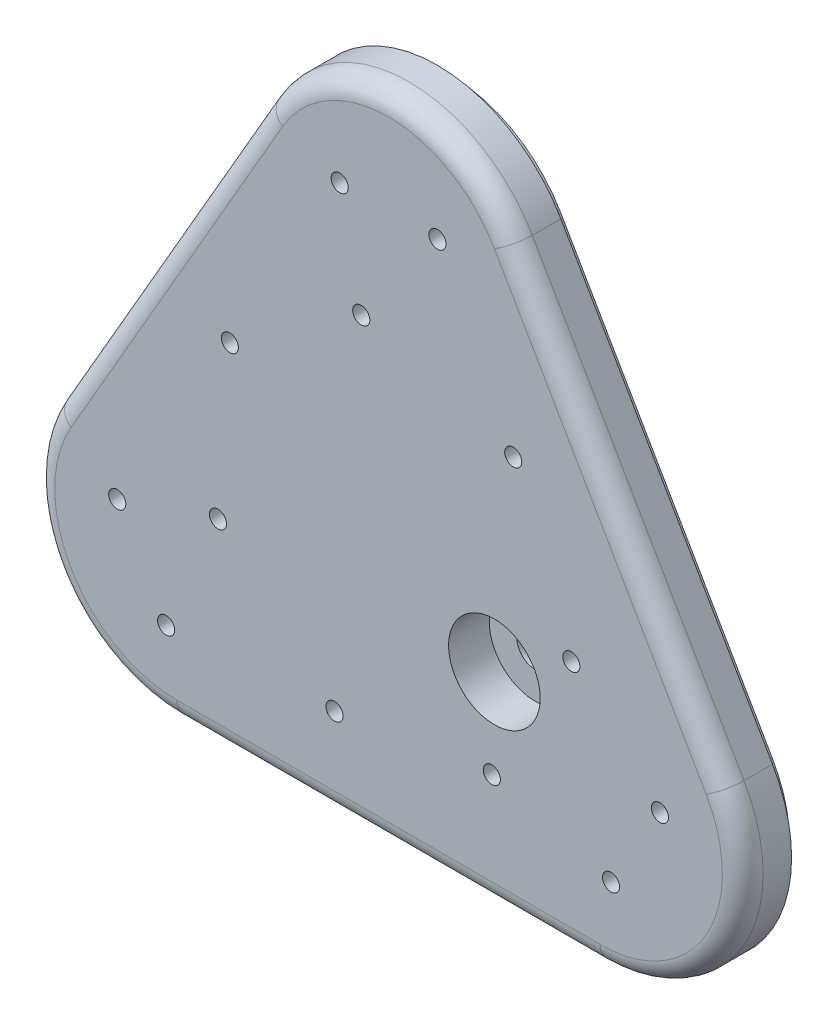
ISO-10303-21;
HEADER;
FILE_DESCRIPTION(('STEP AP214'),'2;1');
FILE_NAME('part.step','',(''),(''),'','','');
FILE_SCHEMA(('AUTOMOTIVE_DESIGN { 1 0 10303 214 1 1 1 1 }'));
ENDSEC;
DATA;
#1=APPLICATION_CONTEXT('core data for automotive mechanical design processes');
#2=APPLICATION_PROTOCOL_DEFINITION('international standard','automotive_design',2000,#1);
#3=PRODUCT_CONTEXT('',#1,'mechanical');
#4=PRODUCT('Part','Part','',(#3));
#5=PRODUCT_RELATED_PRODUCT_CATEGORY('part','',(#4));
#6=PRODUCT_DEFINITION_FORMATION('','',#4);
#7=PRODUCT_DEFINITION_CONTEXT('part definition',#1,'design');
#8=PRODUCT_DEFINITION('design','',#6,#7);
#9=PRODUCT_DEFINITION_SHAPE('','',#8);
#10=(LENGTH_UNIT() NAMED_UNIT(*) SI_UNIT(.MILLI.,.METRE.));
#11=(NAMED_UNIT(*) PLANE_ANGLE_UNIT() SI_UNIT($,.RADIAN.));
#12=(NAMED_UNIT(*) SI_UNIT($,.STERADIAN.) SOLID_ANGLE_UNIT());
#13=UNCERTAINTY_MEASURE_WITH_UNIT(LENGTH_MEASURE(1.E-05),#10,'distance_accuracy_value','');
#14=(GEOMETRIC_REPRESENTATION_CONTEXT(3) GLOBAL_UNCERTAINTY_ASSIGNED_CONTEXT((#13)) GLOBAL_UNIT_ASSIGNED_CONTEXT((#10,
#11,#12)) REPRESENTATION_CONTEXT('',''));
#15=CARTESIAN_POINT('',(0.,0.,0.));
#16=DIRECTION('',(0.,0.,1.));
#17=DIRECTION('',(1.,0.,0.));
#18=AXIS2_PLACEMENT_3D('',#15,#16,#17);
#19=CARTESIAN_POINT('',(25.9807621135331,-15.0000000000001,15.));
#20=DIRECTION('',(0.,0.,-1.));
#21=DIRECTION('',(-1.,0.,0.));
#22=AXIS2_PLACEMENT_3D('',#19,#20,#21);
#23=CYLINDRICAL_SURFACE('',#22,4.5);
#24=CARTESIAN_POINT('',(25.9807621135331,-15.0000000000001,0.));
#25=DIRECTION('',(0.,0.,1.));
#26=DIRECTION('',(1.,0.,0.));
#27=AXIS2_PLACEMENT_3D('',#24,#25,#26);
#28=CIRCLE('',#27,4.5);
#29=CARTESIAN_POINT('',(30.4807621135331,-15.0000000000001,0.));
#30=VERTEX_POINT('',#29);
#31=EDGE_CURVE('E322',#30,#30,#28,.T.);
#32=ORIENTED_EDGE('',*,*,#31,.F.);
#33=EDGE_LOOP('',(#32));
#34=FACE_BOUND('',#33,.T.);
#35=CARTESIAN_POINT('',(25.9807621135331,-15.0000000000001,5.));
#36=DIRECTION('',(0.,0.,1.));
#37=DIRECTION('',(1.,0.,0.));
#38=AXIS2_PLACEMENT_3D('',#35,#36,#37);
#39=CIRCLE('',#38,4.5);
#40=CARTESIAN_POINT('',(30.4807621135331,-15.0000000000001,5.));
#41=VERTEX_POINT('',#40);
#42=EDGE_CURVE('E210',#41,#41,#39,.T.);
#43=ORIENTED_EDGE('',*,*,#42,.T.);
#44=EDGE_LOOP('',(#43));
#45=FACE_BOUND('',#44,.T.);
#46=ADVANCED_FACE('F45',(#34,#45),#23,.F.);
#47=CARTESIAN_POINT('',(0.,60.,0.));
#48=DIRECTION('',(0.,0.,1.));
#49=DIRECTION('',(1.,0.,0.));
#50=AXIS2_PLACEMENT_3D('',#47,#48,#49);
#51=PLANE('',#50);
#52=CARTESIAN_POINT('',(54.6217782649105,-45.3923048454135,0.));
#53=DIRECTION('',(0.,0.,1.));
#54=DIRECTION('',(1.,0.,0.));
#55=AXIS2_PLACEMENT_3D('',#52,#53,#54);
#56=CIRCLE('',#55,2.1);
#57=CARTESIAN_POINT('',(56.7217782649105,-45.3923048454135,0.));
#58=VERTEX_POINT('',#57);
#59=EDGE_CURVE('E317',#58,#58,#56,.T.);
#60=ORIENTED_EDGE('',*,*,#59,.T.);
#61=EDGE_LOOP('',(#60));
#62=FACE_BOUND('',#61,.T.);
#63=ORIENTED_EDGE('',*,*,#31,.T.);
#64=EDGE_LOOP('',(#63));
#65=FACE_BOUND('',#64,.T.);
#66=CARTESIAN_POINT('',(66.6217782649106,-24.6076951545871,0.));
#67=DIRECTION('',(0.,0.,1.));
#68=DIRECTION('',(1.,0.,0.));
#69=AXIS2_PLACEMENT_3D('',#66,#67,#68);
#70=CIRCLE('',#69,2.1);
#71=CARTESIAN_POINT('',(68.7217782649106,-24.6076951545871,0.));
#72=VERTEX_POINT('',#71);
#73=EDGE_CURVE('E329',#72,#72,#70,.T.);
#74=ORIENTED_EDGE('',*,*,#73,.T.);
#75=EDGE_LOOP('',(#74));
#76=FACE_BOUND('',#75,.T.);
#77=CARTESIAN_POINT('',(-54.6217782649111,-45.3923048454127,0.));
#78=DIRECTION('',(0.,0.,1.));
#79=DIRECTION('',(-1.,0.,0.));
#80=AXIS2_PLACEMENT_3D('',#77,#78,#79);
#81=CIRCLE('',#80,2.1);
#82=CARTESIAN_POINT('',(-56.7217782649111,-45.3923048454127,0.));
#83=VERTEX_POINT('',#82);
#84=EDGE_CURVE('E334',#83,#83,#81,.T.);
#85=ORIENTED_EDGE('',*,*,#84,.T.);
#86=EDGE_LOOP('',(#85));
#87=FACE_BOUND('',#86,.T.);
#88=CARTESIAN_POINT('',(12.,70.,0.));
#89=DIRECTION('',(0.,0.,1.));
#90=DIRECTION('',(-1.,0.,0.));
#91=AXIS2_PLACEMENT_3D('',#88,#89,#90);
#92=CIRCLE('',#91,2.1);
#93=CARTESIAN_POINT('',(9.9,70.,0.));
#94=VERTEX_POINT('',#93);
#95=EDGE_CURVE('E342',#94,#94,#92,.T.);
#96=ORIENTED_EDGE('',*,*,#95,.T.);
#97=EDGE_LOOP('',(#96));
#98=FACE_BOUND('',#97,.T.);
#99=CARTESIAN_POINT('',(-66.6217782649109,-24.6076951545861,0.));
#100=DIRECTION('',(0.,0.,1.));
#101=DIRECTION('',(1.,0.,0.));
#102=AXIS2_PLACEMENT_3D('',#99,#100,#101);
#103=CIRCLE('',#102,2.10000000000001);
#104=CARTESIAN_POINT('',(-64.5217782649109,-24.6076951545861,0.));
#105=VERTEX_POINT('',#104);
#106=EDGE_CURVE('E350',#105,#105,#103,.T.);
#107=ORIENTED_EDGE('',*,*,#106,.T.);
#108=EDGE_LOOP('',(#107));
#109=FACE_BOUND('',#108,.T.);
#110=CARTESIAN_POINT('',(-12.,70.,0.));
#111=DIRECTION('',(0.,0.,1.));
#112=DIRECTION('',(1.,0.,0.));
#113=AXIS2_PLACEMENT_3D('',#110,#111,#112);
#114=CIRCLE('',#113,2.1);
#115=CARTESIAN_POINT('',(-9.9,70.,0.));
#116=VERTEX_POINT('',#115);
#117=EDGE_CURVE('E358',#116,#116,#114,.T.);
#118=ORIENTED_EDGE('',*,*,#117,.T.);
#119=EDGE_LOOP('',(#118));
#120=FACE_BOUND('',#119,.T.);
#121=CARTESIAN_POINT('',(-38.9711431702997,22.5,0.));
#122=DIRECTION('',(0.,0.,-1.));
#123=DIRECTION('',(-1.,0.,0.));
#124=AXIS2_PLACEMENT_3D('',#121,#122,#123);
#125=CIRCLE('',#124,2.1);
#126=CARTESIAN_POINT('',(-41.0711431702997,22.5,0.));
#127=VERTEX_POINT('',#126);
#128=EDGE_CURVE('E271',#127,#127,#125,.T.);
#129=ORIENTED_EDGE('',*,*,#128,.F.);
#130=EDGE_LOOP('',(#129));
#131=FACE_BOUND('',#130,.T.);
#132=CARTESIAN_POINT('',(-41.8893186889953,-16.4403460964873,0.));
#133=DIRECTION('',(0.,0.,-1.));
#134=DIRECTION('',(-1.,0.,0.));
#135=AXIS2_PLACEMENT_3D('',#132,#133,#134);
#136=CIRCLE('',#135,2.1);
#137=CARTESIAN_POINT('',(-43.9893186889953,-16.4403460964873,0.));
#138=VERTEX_POINT('',#137);
#139=EDGE_CURVE('E262',#138,#138,#136,.T.);
#140=ORIENTED_EDGE('',*,*,#139,.F.);
#141=EDGE_LOOP('',(#140));
#142=FACE_BOUND('',#141,.T.);
#143=CARTESIAN_POINT('',(-13.263982848501,-43.0007762603804,0.));
#144=DIRECTION('',(0.,0.,-1.));
#145=DIRECTION('',(-1.,0.,0.));
#146=AXIS2_PLACEMENT_3D('',#143,#144,#145);
#147=CIRCLE('',#146,2.1);
#148=CARTESIAN_POINT('',(-15.363982848501,-43.0007762603804,0.));
#149=VERTEX_POINT('',#148);
#150=EDGE_CURVE('E272',#149,#149,#147,.T.);
#151=ORIENTED_EDGE('',*,*,#150,.F.);
#152=EDGE_LOOP('',(#151));
#153=FACE_BOUND('',#152,.T.);
#154=CARTESIAN_POINT('',(25.3494026128536,-37.18074484423,0.));
#155=DIRECTION('',(0.,0.,-1.));
#156=DIRECTION('',(-1.,0.,0.));
#157=AXIS2_PLACEMENT_3D('',#154,#155,#156);
#158=CIRCLE('',#157,2.1);
#159=CARTESIAN_POINT('',(23.2494026128536,-37.18074484423,0.));
#160=VERTEX_POINT('',#159);
#161=EDGE_CURVE('E280',#160,#160,#158,.T.);
#162=ORIENTED_EDGE('',*,*,#161,.F.);
#163=EDGE_LOOP('',(#162));
#164=FACE_BOUND('',#163,.T.);
#165=CARTESIAN_POINT('',(44.8741708731491,-3.36285421140237,0.));
#166=DIRECTION('',(0.,0.,-1.));
#167=DIRECTION('',(-1.,0.,0.));
#168=AXIS2_PLACEMENT_3D('',#165,#166,#167);
#169=CIRCLE('',#168,2.1);
#170=CARTESIAN_POINT('',(42.7741708731491,-3.36285421140237,0.));
#171=VERTEX_POINT('',#170);
#172=EDGE_CURVE('E288',#171,#171,#169,.T.);
#173=ORIENTED_EDGE('',*,*,#172,.F.);
#174=EDGE_LOOP('',(#173));
#175=FACE_BOUND('',#174,.T.);
#176=CARTESIAN_POINT('',(30.6077731996931,32.9873342323312,0.));
#177=DIRECTION('',(0.,0.,-1.));
#178=DIRECTION('',(-1.,0.,0.));
#179=AXIS2_PLACEMENT_3D('',#176,#177,#178);
#180=CIRCLE('',#179,2.1);
#181=CARTESIAN_POINT('',(28.5077731996931,32.9873342323312,0.));
#182=VERTEX_POINT('',#181);
#183=EDGE_CURVE('E296',#182,#182,#180,.T.);
#184=ORIENTED_EDGE('',*,*,#183,.F.);
#185=EDGE_LOOP('',(#184));
#186=FACE_BOUND('',#185,.T.);
#187=CARTESIAN_POINT('',(-6.70690197792434,44.4973871801257,0.));
#188=DIRECTION('',(0.,0.,-1.));
#189=DIRECTION('',(-1.,0.,0.));
#190=AXIS2_PLACEMENT_3D('',#187,#188,#189);
#191=CIRCLE('',#190,2.1);
#192=CARTESIAN_POINT('',(-8.80690197792434,44.4973871801257,0.));
#193=VERTEX_POINT('',#192);
#194=EDGE_CURVE('E261',#193,#193,#191,.T.);
#195=ORIENTED_EDGE('',*,*,#194,.F.);
#196=EDGE_LOOP('',(#195));
#197=FACE_BOUND('',#196,.T.);
#198=CARTESIAN_POINT('',(-51.9615242270666,-29.9999999999995,0.));
#199=DIRECTION('',(0.,0.,-1.));
#200=DIRECTION('',(-1.,0.,0.));
#201=AXIS2_PLACEMENT_3D('',#198,#199,#200);
#202=CIRCLE('',#201,31.5);
#203=CARTESIAN_POINT('',(-51.9615242270669,-61.4999999999995,0.));
#204=VERTEX_POINT('',#203);
#205=CARTESIAN_POINT('',(-79.2413244462764,-14.2499999999994,0.));
#206=VERTEX_POINT('',#205);
#207=EDGE_CURVE('E207',#204,#206,#202,.T.);
#208=ORIENTED_EDGE('',*,*,#207,.T.);
#209=DIRECTION('',(0.500000000000004,0.866025403784436,0.));
#210=VECTOR('',#209,1.);
#211=CARTESIAN_POINT('',(-27.2798002192097,75.7500000000001,0.));
#212=LINE('',#211,#210);
#213=CARTESIAN_POINT('',(-27.2798002192097,75.7500000000001,0.));
#214=VERTEX_POINT('',#213);
#215=EDGE_CURVE('E160',#206,#214,#212,.T.);
#216=ORIENTED_EDGE('',*,*,#215,.T.);
#217=CARTESIAN_POINT('',(0.,60.,0.));
#218=DIRECTION('',(0.,0.,-1.));
#219=DIRECTION('',(-1.,0.,0.));
#220=AXIS2_PLACEMENT_3D('',#217,#218,#219);
#221=CIRCLE('',#220,31.5);
#222=CARTESIAN_POINT('',(27.2798002192099,75.7499999999999,0.));
#223=VERTEX_POINT('',#222);
#224=EDGE_CURVE('E213',#214,#223,#221,.T.);
#225=ORIENTED_EDGE('',*,*,#224,.T.);
#226=DIRECTION('',(0.499999999999998,-0.86602540378444,0.));
#227=VECTOR('',#226,1.);
#228=CARTESIAN_POINT('',(79.241324446276,-14.2500000000003,0.));
#229=LINE('',#228,#227);
#230=CARTESIAN_POINT('',(79.2413244462757,-14.2500000000005,0.));
#231=VERTEX_POINT('',#230);
#232=EDGE_CURVE('E217',#223,#231,#229,.T.);
#233=ORIENTED_EDGE('',*,*,#232,.T.);
#234=CARTESIAN_POINT('',(51.9615242270662,-30.0000000000002,0.));
#235=DIRECTION('',(0.,0.,-1.));
#236=DIRECTION('',(-1.,0.,0.));
#237=AXIS2_PLACEMENT_3D('',#234,#235,#236);
#238=CIRCLE('',#237,31.4999999999996);
#239=CARTESIAN_POINT('',(51.9615242270659,-61.4999999999995,0.));
#240=VERTEX_POINT('',#239);
#241=EDGE_CURVE('E189',#231,#240,#238,.T.);
#242=ORIENTED_EDGE('',*,*,#241,.T.);
#243=DIRECTION('',(-1.,0.,0.));
#244=VECTOR('',#243,1.);
#245=CARTESIAN_POINT('',(-51.9615242270669,-61.4999999999995,0.));
#246=LINE('',#245,#244);
#247=EDGE_CURVE('E185',#240,#204,#246,.T.);
#248=ORIENTED_EDGE('',*,*,#247,.T.);
#249=EDGE_LOOP('',(#208,#216,#225,#233,#242,#248));
#250=FACE_BOUND('',#249,.T.);
#251=ADVANCED_FACE('F472',(#62,#65,#76,#87,#98,#109,#120,#131,#142,#153,#164,#175,#186,#197,
#250),#51,.F.);
#252=CARTESIAN_POINT('',(0.,60.,15.));
#253=DIRECTION('',(0.,0.,-1.));
#254=DIRECTION('',(-1.,0.,0.));
#255=AXIS2_PLACEMENT_3D('',#252,#253,#254);
#256=CYLINDRICAL_SURFACE('',#255,35.);
#257=DIRECTION('',(0.,0.,-1.));
#258=VECTOR('',#257,1.);
#259=CARTESIAN_POINT('',(-30.3108891324553,77.5000000000001,15.));
#260=LINE('',#259,#258);
#261=CARTESIAN_POINT('',(-30.3108891324553,77.5000000000001,10.));
#262=VERTEX_POINT('',#261);
#263=CARTESIAN_POINT('',(-30.3108891324553,77.5000000000001,3.));
#264=VERTEX_POINT('',#263);
#265=EDGE_CURVE('E384',#262,#264,#260,.T.);
#266=ORIENTED_EDGE('',*,*,#265,.F.);
#267=CARTESIAN_POINT('',(0.,60.,10.));
#268=DIRECTION('',(0.,0.,1.));
#269=DIRECTION('',(1.,0.,0.));
#270=AXIS2_PLACEMENT_3D('',#267,#268,#269);
#271=CIRCLE('',#270,35.);
#272=CARTESIAN_POINT('',(30.3108891324554,77.4999999999999,10.));
#273=VERTEX_POINT('',#272);
#274=EDGE_CURVE('E410',#262,#273,#271,.F.);
#275=ORIENTED_EDGE('',*,*,#274,.T.);
#276=DIRECTION('',(0.,0.,-1.));
#277=VECTOR('',#276,1.);
#278=CARTESIAN_POINT('',(30.3108891324554,77.4999999999999,15.));
#279=LINE('',#278,#277);
#280=CARTESIAN_POINT('',(30.3108891324554,77.4999999999999,3.));
#281=VERTEX_POINT('',#280);
#282=EDGE_CURVE('E366',#273,#281,#279,.T.);
#283=ORIENTED_EDGE('',*,*,#282,.T.);
#284=CARTESIAN_POINT('',(0.,60.,3.));
#285=DIRECTION('',(0.,0.,-1.));
#286=DIRECTION('',(-1.,0.,0.));
#287=AXIS2_PLACEMENT_3D('',#284,#285,#286);
#288=CIRCLE('',#287,35.);
#289=EDGE_CURVE('E253',#264,#281,#288,.T.);
#290=ORIENTED_EDGE('',*,*,#289,.F.);
#291=EDGE_LOOP('',(#266,#275,#283,#290));
#292=FACE_BOUND('',#291,.T.);
#293=ADVANCED_FACE('F478',(#292),#256,.T.);
#294=CARTESIAN_POINT('',(-30.3108891324553,77.5000000000001,15.));
#295=DIRECTION('',(0.866025403784436,-0.500000000000004,0.));
#296=DIRECTION('',(0.500000000000004,0.866025403784436,0.));
#297=AXIS2_PLACEMENT_3D('',#294,#295,#296);
#298=PLANE('',#297);
#299=DIRECTION('',(0.,0.,-1.));
#300=VECTOR('',#299,1.);
#301=CARTESIAN_POINT('',(-82.2724133595219,-12.4999999999994,15.));
#302=LINE('',#301,#300);
#303=CARTESIAN_POINT('',(-82.2724133595219,-12.4999999999994,10.));
#304=VERTEX_POINT('',#303);
#305=CARTESIAN_POINT('',(-82.2724133595219,-12.4999999999994,3.));
#306=VERTEX_POINT('',#305);
#307=EDGE_CURVE('E381',#304,#306,#302,.T.);
#308=ORIENTED_EDGE('',*,*,#307,.F.);
#309=DIRECTION('',(-0.500000000000004,-0.866025403784436,0.));
#310=VECTOR('',#309,1.);
#311=CARTESIAN_POINT('',(-30.3108891324553,77.5000000000001,10.));
#312=LINE('',#311,#310);
#313=EDGE_CURVE('E11',#304,#262,#312,.F.);
#314=ORIENTED_EDGE('',*,*,#313,.T.);
#315=ORIENTED_EDGE('',*,*,#265,.T.);
#316=DIRECTION('',(0.500000000000004,0.866025403784436,0.));
#317=VECTOR('',#316,1.);
#318=CARTESIAN_POINT('',(-30.3108891324553,77.5000000000001,3.));
#319=LINE('',#318,#317);
#320=EDGE_CURVE('E249',#306,#264,#319,.T.);
#321=ORIENTED_EDGE('',*,*,#320,.F.);
#322=EDGE_LOOP('',(#308,#314,#315,#321));
#323=FACE_BOUND('',#322,.T.);
#324=ADVANCED_FACE('F525',(#323),#298,.F.);
#325=CARTESIAN_POINT('',(-51.9615242270666,-29.9999999999995,15.));
#326=DIRECTION('',(0.,0.,-1.));
#327=DIRECTION('',(-1.,0.,0.));
#328=AXIS2_PLACEMENT_3D('',#325,#326,#327);
#329=CYLINDRICAL_SURFACE('',#328,35.);
#330=DIRECTION('',(0.,0.,-1.));
#331=VECTOR('',#330,1.);
#332=CARTESIAN_POINT('',(-51.9615242270669,-64.9999999999995,15.));
#333=LINE('',#332,#331);
#334=CARTESIAN_POINT('',(-51.9615242270669,-64.9999999999995,10.));
#335=VERTEX_POINT('',#334);
#336=CARTESIAN_POINT('',(-51.9615242270668,-64.9999999999995,3.));
#337=VERTEX_POINT('',#336);
#338=EDGE_CURVE('E378',#335,#337,#333,.T.);
#339=ORIENTED_EDGE('',*,*,#338,.F.);
#340=CARTESIAN_POINT('',(-51.9615242270666,-29.9999999999995,10.));
#341=DIRECTION('',(0.,0.,1.));
#342=DIRECTION('',(1.,0.,0.));
#343=AXIS2_PLACEMENT_3D('',#340,#341,#342);
#344=CIRCLE('',#343,35.);
#345=EDGE_CURVE('E55',#335,#304,#344,.F.);
#346=ORIENTED_EDGE('',*,*,#345,.T.);
#347=ORIENTED_EDGE('',*,*,#307,.T.);
#348=CARTESIAN_POINT('',(-51.9615242270666,-29.9999999999995,3.));
#349=DIRECTION('',(0.,0.,-1.));
#350=DIRECTION('',(-1.,0.,0.));
#351=AXIS2_PLACEMENT_3D('',#348,#349,#350);
#352=CIRCLE('',#351,35.);
#353=EDGE_CURVE('E245',#337,#306,#352,.T.);
#354=ORIENTED_EDGE('',*,*,#353,.F.);
#355=EDGE_LOOP('',(#339,#346,#347,#354));
#356=FACE_BOUND('',#355,.T.);
#357=ADVANCED_FACE('F522',(#356),#329,.T.);
#358=CARTESIAN_POINT('',(-51.9615242270668,-64.9999999999995,15.));
#359=DIRECTION('',(0.,1.,0.));
#360=DIRECTION('',(-1.,0.,0.));
#361=AXIS2_PLACEMENT_3D('',#358,#359,#360);
#362=PLANE('',#361);
#363=DIRECTION('',(0.,0.,-1.));
#364=VECTOR('',#363,1.);
#365=CARTESIAN_POINT('',(51.9615242270659,-65.0000000000003,15.));
#366=LINE('',#365,#364);
#367=CARTESIAN_POINT('',(51.9615242270659,-65.0000000000003,10.));
#368=VERTEX_POINT('',#367);
#369=CARTESIAN_POINT('',(51.9615242270659,-65.0000000000003,3.));
#370=VERTEX_POINT('',#369);
#371=EDGE_CURVE('E375',#368,#370,#366,.T.);
#372=ORIENTED_EDGE('',*,*,#371,.F.);
#373=DIRECTION('',(1.,0.,0.));
#374=VECTOR('',#373,1.);
#375=CARTESIAN_POINT('',(-51.9615242270669,-64.9999999999995,10.));
#376=LINE('',#375,#374);
#377=EDGE_CURVE('E70',#368,#335,#376,.F.);
#378=ORIENTED_EDGE('',*,*,#377,.T.);
#379=ORIENTED_EDGE('',*,*,#338,.T.);
#380=DIRECTION('',(-1.,0.,0.));
#381=VECTOR('',#380,1.);
#382=CARTESIAN_POINT('',(-51.9615242270669,-64.9999999999995,3.));
#383=LINE('',#382,#381);
#384=EDGE_CURVE('E241',#370,#337,#383,.T.);
#385=ORIENTED_EDGE('',*,*,#384,.F.);
#386=EDGE_LOOP('',(#372,#378,#379,#385));
#387=FACE_BOUND('',#386,.T.);
#388=ADVANCED_FACE('F518',(#387),#362,.F.);
#389=CARTESIAN_POINT('',(51.9615242270662,-30.0000000000002,15.));
#390=DIRECTION('',(0.,0.,-1.));
#391=DIRECTION('',(-1.,0.,0.));
#392=AXIS2_PLACEMENT_3D('',#389,#390,#391);
#393=CYLINDRICAL_SURFACE('',#392,35.);
#394=DIRECTION('',(0.,0.,-1.));
#395=VECTOR('',#394,1.);
#396=CARTESIAN_POINT('',(82.2724133595216,-12.5000000000003,15.));
#397=LINE('',#396,#395);
#398=CARTESIAN_POINT('',(82.2724133595216,-12.5000000000003,10.));
#399=VERTEX_POINT('',#398);
#400=CARTESIAN_POINT('',(82.2724133595216,-12.5000000000003,3.));
#401=VERTEX_POINT('',#400);
#402=EDGE_CURVE('E372',#399,#401,#397,.T.);
#403=ORIENTED_EDGE('',*,*,#402,.F.);
#404=CARTESIAN_POINT('',(51.9615242270662,-30.0000000000002,10.));
#405=DIRECTION('',(0.,0.,1.));
#406=DIRECTION('',(1.,0.,0.));
#407=AXIS2_PLACEMENT_3D('',#404,#405,#406);
#408=CIRCLE('',#407,35.);
#409=EDGE_CURVE('E417',#399,#368,#408,.F.);
#410=ORIENTED_EDGE('',*,*,#409,.T.);
#411=ORIENTED_EDGE('',*,*,#371,.T.);
#412=CARTESIAN_POINT('',(51.9615242270662,-30.0000000000002,3.));
#413=DIRECTION('',(0.,0.,-1.));
#414=DIRECTION('',(-1.,0.,0.));
#415=AXIS2_PLACEMENT_3D('',#412,#413,#414);
#416=CIRCLE('',#415,35.);
#417=EDGE_CURVE('E226',#401,#370,#416,.T.);
#418=ORIENTED_EDGE('',*,*,#417,.F.);
#419=EDGE_LOOP('',(#403,#410,#411,#418));
#420=FACE_BOUND('',#419,.T.);
#421=ADVANCED_FACE('F514',(#420),#393,.T.);
#422=CARTESIAN_POINT('',(30.3108891324554,77.4999999999999,15.));
#423=DIRECTION('',(-0.86602540378444,-0.499999999999998,0.));
#424=DIRECTION('',(0.499999999999998,-0.86602540378444,0.));
#425=AXIS2_PLACEMENT_3D('',#422,#423,#424);
#426=PLANE('',#425);
#427=ORIENTED_EDGE('',*,*,#282,.F.);
#428=DIRECTION('',(-0.499999999999998,0.86602540378444,0.));
#429=VECTOR('',#428,1.);
#430=CARTESIAN_POINT('',(82.2724133595216,-12.5000000000003,10.));
#431=LINE('',#430,#429);
#432=EDGE_CURVE('E414',#273,#399,#431,.F.);
#433=ORIENTED_EDGE('',*,*,#432,.T.);
#434=ORIENTED_EDGE('',*,*,#402,.T.);
#435=DIRECTION('',(0.499999999999998,-0.86602540378444,0.));
#436=VECTOR('',#435,1.);
#437=CARTESIAN_POINT('',(82.2724133595216,-12.5000000000003,3.));
#438=LINE('',#437,#436);
#439=EDGE_CURVE('E257',#281,#401,#438,.T.);
#440=ORIENTED_EDGE('',*,*,#439,.F.);
#441=EDGE_LOOP('',(#427,#433,#434,#440));
#442=FACE_BOUND('',#441,.T.);
#443=ADVANCED_FACE('F509',(#442),#426,.F.);
#444=CARTESIAN_POINT('',(0.,60.,15.));
#445=DIRECTION('',(0.,0.,1.));
#446=DIRECTION('',(1.,0.,0.));
#447=AXIS2_PLACEMENT_3D('',#444,#445,#446);
#448=PLANE('',#447);
#449=DIRECTION('',(-0.499999999999998,0.86602540378444,0.));
#450=VECTOR('',#449,1.);
#451=CARTESIAN_POINT('',(25.9807621135332,74.9999999999999,15.));
#452=LINE('',#451,#450);
#453=CARTESIAN_POINT('',(77.9422863405994,-15.0000000000003,15.));
#454=VERTEX_POINT('',#453);
#455=CARTESIAN_POINT('',(25.9807621135332,74.9999999999999,15.));
#456=VERTEX_POINT('',#455);
#457=EDGE_CURVE('E403',#454,#456,#452,.T.);
#458=ORIENTED_EDGE('',*,*,#457,.T.);
#459=CARTESIAN_POINT('',(0.,60.,15.));
#460=DIRECTION('',(0.,0.,1.));
#461=DIRECTION('',(1.,0.,0.));
#462=AXIS2_PLACEMENT_3D('',#459,#460,#461);
#463=CIRCLE('',#462,30.);
#464=CARTESIAN_POINT('',(-25.9807621135331,75.0000000000001,15.));
#465=VERTEX_POINT('',#464);
#466=EDGE_CURVE('E406',#456,#465,#463,.T.);
#467=ORIENTED_EDGE('',*,*,#466,.T.);
#468=DIRECTION('',(-0.500000000000004,-0.866025403784436,0.));
#469=VECTOR('',#468,1.);
#470=CARTESIAN_POINT('',(-77.9422863405997,-14.9999999999994,15.));
#471=LINE('',#470,#469);
#472=CARTESIAN_POINT('',(-77.9422863405997,-14.9999999999994,15.));
#473=VERTEX_POINT('',#472);
#474=EDGE_CURVE('E387',#465,#473,#471,.T.);
#475=ORIENTED_EDGE('',*,*,#474,.T.);
#476=CARTESIAN_POINT('',(-51.9615242270666,-29.9999999999995,15.));
#477=DIRECTION('',(0.,0.,1.));
#478=DIRECTION('',(1.,0.,0.));
#479=AXIS2_PLACEMENT_3D('',#476,#477,#478);
#480=CIRCLE('',#479,30.);
#481=CARTESIAN_POINT('',(-51.9615242270668,-59.9999999999995,15.));
#482=VERTEX_POINT('',#481);
#483=EDGE_CURVE('E394',#473,#482,#480,.T.);
#484=ORIENTED_EDGE('',*,*,#483,.T.);
#485=DIRECTION('',(1.,0.,0.));
#486=VECTOR('',#485,1.);
#487=CARTESIAN_POINT('',(51.961524227066,-60.0000000000002,15.));
#488=LINE('',#487,#486);
#489=CARTESIAN_POINT('',(51.961524227066,-60.0000000000002,15.));
#490=VERTEX_POINT('',#489);
#491=EDGE_CURVE('E397',#482,#490,#488,.T.);
#492=ORIENTED_EDGE('',*,*,#491,.T.);
#493=CARTESIAN_POINT('',(51.9615242270662,-30.0000000000002,15.));
#494=DIRECTION('',(0.,0.,1.));
#495=DIRECTION('',(1.,0.,0.));
#496=AXIS2_PLACEMENT_3D('',#493,#494,#495);
#497=CIRCLE('',#496,30.);
#498=EDGE_CURVE('E400',#490,#454,#497,.T.);
#499=ORIENTED_EDGE('',*,*,#498,.T.);
#500=EDGE_LOOP('',(#458,#467,#475,#484,#492,#499));
#501=FACE_BOUND('',#500,.T.);
#502=CARTESIAN_POINT('',(25.9807621135331,-15.0000000000001,15.));
#503=DIRECTION('',(0.,0.,1.));
#504=DIRECTION('',(1.,0.,0.));
#505=AXIS2_PLACEMENT_3D('',#502,#503,#504);
#506=CIRCLE('',#505,11.25);
#507=CARTESIAN_POINT('',(37.2307621135331,-15.0000000000001,15.));
#508=VERTEX_POINT('',#507);
#509=EDGE_CURVE('E192',#508,#508,#506,.T.);
#510=ORIENTED_EDGE('',*,*,#509,.F.);
#511=EDGE_LOOP('',(#510));
#512=FACE_BOUND('',#511,.T.);
#513=CARTESIAN_POINT('',(-6.70690197792434,44.4973871801257,15.));
#514=DIRECTION('',(0.,0.,1.));
#515=DIRECTION('',(1.,0.,0.));
#516=AXIS2_PLACEMENT_3D('',#513,#514,#515);
#517=CIRCLE('',#516,2.1);
#518=CARTESIAN_POINT('',(-4.60690197792434,44.4973871801257,15.));
#519=VERTEX_POINT('',#518);
#520=EDGE_CURVE('E300',#519,#519,#517,.F.);
#521=ORIENTED_EDGE('',*,*,#520,.T.);
#522=EDGE_LOOP('',(#521));
#523=FACE_BOUND('',#522,.T.);
#524=CARTESIAN_POINT('',(30.6077731996931,32.9873342323312,15.));
#525=DIRECTION('',(0.,0.,1.));
#526=DIRECTION('',(1.,0.,0.));
#527=AXIS2_PLACEMENT_3D('',#524,#525,#526);
#528=CIRCLE('',#527,2.1);
#529=CARTESIAN_POINT('',(32.7077731996931,32.9873342323312,15.));
#530=VERTEX_POINT('',#529);
#531=EDGE_CURVE('E292',#530,#530,#528,.F.);
#532=ORIENTED_EDGE('',*,*,#531,.T.);
#533=EDGE_LOOP('',(#532));
#534=FACE_BOUND('',#533,.T.);
#535=CARTESIAN_POINT('',(44.8741708731491,-3.36285421140237,15.));
#536=DIRECTION('',(0.,0.,1.));
#537=DIRECTION('',(1.,0.,0.));
#538=AXIS2_PLACEMENT_3D('',#535,#536,#537);
#539=CIRCLE('',#538,2.1);
#540=CARTESIAN_POINT('',(46.9741708731491,-3.36285421140237,15.));
#541=VERTEX_POINT('',#540);
#542=EDGE_CURVE('E284',#541,#541,#539,.F.);
#543=ORIENTED_EDGE('',*,*,#542,.T.);
#544=EDGE_LOOP('',(#543));
#545=FACE_BOUND('',#544,.T.);
#546=CARTESIAN_POINT('',(25.3494026128536,-37.18074484423,15.));
#547=DIRECTION('',(0.,0.,1.));
#548=DIRECTION('',(1.,0.,0.));
#549=AXIS2_PLACEMENT_3D('',#546,#547,#548);
#550=CIRCLE('',#549,2.1);
#551=CARTESIAN_POINT('',(27.4494026128536,-37.18074484423,15.));
#552=VERTEX_POINT('',#551);
#553=EDGE_CURVE('E276',#552,#552,#550,.F.);
#554=ORIENTED_EDGE('',*,*,#553,.T.);
#555=EDGE_LOOP('',(#554));
#556=FACE_BOUND('',#555,.T.);
#557=CARTESIAN_POINT('',(-13.263982848501,-43.0007762603804,15.));
#558=DIRECTION('',(0.,0.,1.));
#559=DIRECTION('',(1.,0.,0.));
#560=AXIS2_PLACEMENT_3D('',#557,#558,#559);
#561=CIRCLE('',#560,2.1);
#562=CARTESIAN_POINT('',(-11.163982848501,-43.0007762603804,15.));
#563=VERTEX_POINT('',#562);
#564=EDGE_CURVE('E267',#563,#563,#561,.F.);
#565=ORIENTED_EDGE('',*,*,#564,.T.);
#566=EDGE_LOOP('',(#565));
#567=FACE_BOUND('',#566,.T.);
#568=CARTESIAN_POINT('',(-41.8893186889953,-16.4403460964873,15.));
#569=DIRECTION('',(0.,0.,1.));
#570=DIRECTION('',(1.,0.,0.));
#571=AXIS2_PLACEMENT_3D('',#568,#569,#570);
#572=CIRCLE('',#571,2.1);
#573=CARTESIAN_POINT('',(-39.7893186889954,-16.4403460964873,15.));
#574=VERTEX_POINT('',#573);
#575=EDGE_CURVE('E266',#574,#574,#572,.F.);
#576=ORIENTED_EDGE('',*,*,#575,.T.);
#577=EDGE_LOOP('',(#576));
#578=FACE_BOUND('',#577,.T.);
#579=CARTESIAN_POINT('',(-38.9711431702997,22.5,15.));
#580=DIRECTION('',(0.,0.,1.));
#581=DIRECTION('',(1.,0.,0.));
#582=AXIS2_PLACEMENT_3D('',#579,#580,#581);
#583=CIRCLE('',#582,2.1);
#584=CARTESIAN_POINT('',(-36.8711431702997,22.5,15.));
#585=VERTEX_POINT('',#584);
#586=EDGE_CURVE('E313',#585,#585,#583,.F.);
#587=ORIENTED_EDGE('',*,*,#586,.T.);
#588=EDGE_LOOP('',(#587));
#589=FACE_BOUND('',#588,.T.);
#590=CARTESIAN_POINT('',(-54.6217782649111,-45.3923048454127,15.));
#591=DIRECTION('',(0.,0.,1.));
#592=DIRECTION('',(-1.,0.,0.));
#593=AXIS2_PLACEMENT_3D('',#590,#591,#592);
#594=CIRCLE('',#593,2.1);
#595=CARTESIAN_POINT('',(-56.7217782649111,-45.3923048454127,15.));
#596=VERTEX_POINT('',#595);
#597=EDGE_CURVE('E338',#596,#596,#594,.T.);
#598=ORIENTED_EDGE('',*,*,#597,.F.);
#599=EDGE_LOOP('',(#598));
#600=FACE_BOUND('',#599,.T.);
#601=CARTESIAN_POINT('',(-66.6217782649109,-24.6076951545861,15.));
#602=DIRECTION('',(0.,0.,1.));
#603=DIRECTION('',(1.,0.,0.));
#604=AXIS2_PLACEMENT_3D('',#601,#602,#603);
#605=CIRCLE('',#604,2.10000000000001);
#606=CARTESIAN_POINT('',(-64.5217782649109,-24.6076951545861,15.));
#607=VERTEX_POINT('',#606);
#608=EDGE_CURVE('E354',#607,#607,#605,.T.);
#609=ORIENTED_EDGE('',*,*,#608,.F.);
#610=EDGE_LOOP('',(#609));
#611=FACE_BOUND('',#610,.T.);
#612=CARTESIAN_POINT('',(-12.,70.,15.));
#613=DIRECTION('',(0.,0.,1.));
#614=DIRECTION('',(1.,0.,0.));
#615=AXIS2_PLACEMENT_3D('',#612,#613,#614);
#616=CIRCLE('',#615,2.1);
#617=CARTESIAN_POINT('',(-9.9,70.,15.));
#618=VERTEX_POINT('',#617);
#619=EDGE_CURVE('E362',#618,#618,#616,.T.);
#620=ORIENTED_EDGE('',*,*,#619,.F.);
#621=EDGE_LOOP('',(#620));
#622=FACE_BOUND('',#621,.T.);
#623=CARTESIAN_POINT('',(12.,70.,15.));
#624=DIRECTION('',(0.,0.,1.));
#625=DIRECTION('',(-1.,0.,0.));
#626=AXIS2_PLACEMENT_3D('',#623,#624,#625);
#627=CIRCLE('',#626,2.1);
#628=CARTESIAN_POINT('',(9.9,70.,15.));
#629=VERTEX_POINT('',#628);
#630=EDGE_CURVE('E346',#629,#629,#627,.T.);
#631=ORIENTED_EDGE('',*,*,#630,.F.);
#632=EDGE_LOOP('',(#631));
#633=FACE_BOUND('',#632,.T.);
#634=CARTESIAN_POINT('',(66.6217782649106,-24.6076951545871,15.));
#635=DIRECTION('',(0.,0.,1.));
#636=DIRECTION('',(1.,0.,0.));
#637=AXIS2_PLACEMENT_3D('',#634,#635,#636);
#638=CIRCLE('',#637,2.1);
#639=CARTESIAN_POINT('',(68.7217782649106,-24.6076951545871,15.));
#640=VERTEX_POINT('',#639);
#641=EDGE_CURVE('E330',#640,#640,#638,.T.);
#642=ORIENTED_EDGE('',*,*,#641,.F.);
#643=EDGE_LOOP('',(#642));
#644=FACE_BOUND('',#643,.T.);
#645=CARTESIAN_POINT('',(54.6217782649105,-45.3923048454135,15.));
#646=DIRECTION('',(0.,0.,1.));
#647=DIRECTION('',(1.,0.,0.));
#648=AXIS2_PLACEMENT_3D('',#645,#646,#647);
#649=CIRCLE('',#648,2.1);
#650=CARTESIAN_POINT('',(56.7217782649105,-45.3923048454135,15.));
#651=VERTEX_POINT('',#650);
#652=EDGE_CURVE('E318',#651,#651,#649,.T.);
#653=ORIENTED_EDGE('',*,*,#652,.F.);
#654=EDGE_LOOP('',(#653));
#655=FACE_BOUND('',#654,.T.);
#656=ADVANCED_FACE('F506',(#501,#512,#523,#534,#545,#556,#567,#578,#589,#600,#611,#622,#633,
#644,#655),#448,.T.);
#657=CARTESIAN_POINT('',(-12.,70.,15.));
#658=DIRECTION('',(0.,0.,-1.));
#659=DIRECTION('',(-1.,0.,0.));
#660=AXIS2_PLACEMENT_3D('',#657,#658,#659);
#661=CYLINDRICAL_SURFACE('',#660,2.1);
#662=ORIENTED_EDGE('',*,*,#619,.T.);
#663=EDGE_LOOP('',(#662));
#664=FACE_BOUND('',#663,.T.);
#665=ORIENTED_EDGE('',*,*,#117,.F.);
#666=EDGE_LOOP('',(#665));
#667=FACE_BOUND('',#666,.T.);
#668=ADVANCED_FACE('F502',(#664,#667),#661,.F.);
#669=CARTESIAN_POINT('',(-66.6217782649109,-24.6076951545861,15.));
#670=DIRECTION('',(0.,0.,-1.));
#671=DIRECTION('',(-1.,0.,0.));
#672=AXIS2_PLACEMENT_3D('',#669,#670,#671);
#673=CYLINDRICAL_SURFACE('',#672,2.10000000000001);
#674=ORIENTED_EDGE('',*,*,#608,.T.);
#675=EDGE_LOOP('',(#674));
#676=FACE_BOUND('',#675,.T.);
#677=ORIENTED_EDGE('',*,*,#106,.F.);
#678=EDGE_LOOP('',(#677));
#679=FACE_BOUND('',#678,.T.);
#680=ADVANCED_FACE('F498',(#676,#679),#673,.F.);
#681=CARTESIAN_POINT('',(12.,70.,15.));
#682=DIRECTION('',(0.,0.,-1.));
#683=DIRECTION('',(-1.,0.,0.));
#684=AXIS2_PLACEMENT_3D('',#681,#682,#683);
#685=CYLINDRICAL_SURFACE('',#684,2.1);
#686=ORIENTED_EDGE('',*,*,#630,.T.);
#687=EDGE_LOOP('',(#686));
#688=FACE_BOUND('',#687,.T.);
#689=ORIENTED_EDGE('',*,*,#95,.F.);
#690=EDGE_LOOP('',(#689));
#691=FACE_BOUND('',#690,.T.);
#692=ADVANCED_FACE('F494',(#688,#691),#685,.F.);
#693=CARTESIAN_POINT('',(-54.6217782649111,-45.3923048454127,15.));
#694=DIRECTION('',(0.,0.,-1.));
#695=DIRECTION('',(-1.,0.,0.));
#696=AXIS2_PLACEMENT_3D('',#693,#694,#695);
#697=CYLINDRICAL_SURFACE('',#696,2.1);
#698=ORIENTED_EDGE('',*,*,#597,.T.);
#699=EDGE_LOOP('',(#698));
#700=FACE_BOUND('',#699,.T.);
#701=ORIENTED_EDGE('',*,*,#84,.F.);
#702=EDGE_LOOP('',(#701));
#703=FACE_BOUND('',#702,.T.);
#704=ADVANCED_FACE('F490',(#700,#703),#697,.F.);
#705=CARTESIAN_POINT('',(66.6217782649106,-24.6076951545871,15.));
#706=DIRECTION('',(0.,0.,-1.));
#707=DIRECTION('',(-1.,0.,0.));
#708=AXIS2_PLACEMENT_3D('',#705,#706,#707);
#709=CYLINDRICAL_SURFACE('',#708,2.1);
#710=ORIENTED_EDGE('',*,*,#641,.T.);
#711=EDGE_LOOP('',(#710));
#712=FACE_BOUND('',#711,.T.);
#713=ORIENTED_EDGE('',*,*,#73,.F.);
#714=EDGE_LOOP('',(#713));
#715=FACE_BOUND('',#714,.T.);
#716=ADVANCED_FACE('F487',(#712,#715),#709,.F.);
#717=CARTESIAN_POINT('',(54.6217782649105,-45.3923048454135,15.));
#718=DIRECTION('',(0.,0.,-1.));
#719=DIRECTION('',(-1.,0.,0.));
#720=AXIS2_PLACEMENT_3D('',#717,#718,#719);
#721=CYLINDRICAL_SURFACE('',#720,2.1);
#722=ORIENTED_EDGE('',*,*,#652,.T.);
#723=EDGE_LOOP('',(#722));
#724=FACE_BOUND('',#723,.T.);
#725=ORIENTED_EDGE('',*,*,#59,.F.);
#726=EDGE_LOOP('',(#725));
#727=FACE_BOUND('',#726,.T.);
#728=ADVANCED_FACE('F485',(#724,#727),#721,.F.);
#729=CARTESIAN_POINT('',(-38.9711431702997,22.5,20.939696961967));
#730=DIRECTION('',(0.,0.,-1.));
#731=DIRECTION('',(-1.,0.,0.));
#732=AXIS2_PLACEMENT_3D('',#729,#730,#731);
#733=CYLINDRICAL_SURFACE('',#732,2.1);
#734=ORIENTED_EDGE('',*,*,#128,.T.);
#735=EDGE_LOOP('',(#734));
#736=FACE_BOUND('',#735,.T.);
#737=ORIENTED_EDGE('',*,*,#586,.F.);
#738=EDGE_LOOP('',(#737));
#739=FACE_BOUND('',#738,.T.);
#740=ADVANCED_FACE('F602',(#736,#739),#733,.F.);
#741=CARTESIAN_POINT('',(-41.8893186889953,-16.4403460964873,20.939696961967));
#742=DIRECTION('',(0.,0.,-1.));
#743=DIRECTION('',(-1.,0.,0.));
#744=AXIS2_PLACEMENT_3D('',#741,#742,#743);
#745=CYLINDRICAL_SURFACE('',#744,2.1);
#746=ORIENTED_EDGE('',*,*,#139,.T.);
#747=EDGE_LOOP('',(#746));
#748=FACE_BOUND('',#747,.T.);
#749=ORIENTED_EDGE('',*,*,#575,.F.);
#750=EDGE_LOOP('',(#749));
#751=FACE_BOUND('',#750,.T.);
#752=ADVANCED_FACE('F654',(#748,#751),#745,.F.);
#753=CARTESIAN_POINT('',(-13.263982848501,-43.0007762603804,20.939696961967));
#754=DIRECTION('',(0.,0.,-1.));
#755=DIRECTION('',(-1.,0.,0.));
#756=AXIS2_PLACEMENT_3D('',#753,#754,#755);
#757=CYLINDRICAL_SURFACE('',#756,2.1);
#758=ORIENTED_EDGE('',*,*,#150,.T.);
#759=EDGE_LOOP('',(#758));
#760=FACE_BOUND('',#759,.T.);
#761=ORIENTED_EDGE('',*,*,#564,.F.);
#762=EDGE_LOOP('',(#761));
#763=FACE_BOUND('',#762,.T.);
#764=ADVANCED_FACE('F657',(#760,#763),#757,.F.);
#765=CARTESIAN_POINT('',(25.3494026128536,-37.18074484423,20.939696961967));
#766=DIRECTION('',(0.,0.,-1.));
#767=DIRECTION('',(-1.,0.,0.));
#768=AXIS2_PLACEMENT_3D('',#765,#766,#767);
#769=CYLINDRICAL_SURFACE('',#768,2.1);
#770=ORIENTED_EDGE('',*,*,#161,.T.);
#771=EDGE_LOOP('',(#770));
#772=FACE_BOUND('',#771,.T.);
#773=ORIENTED_EDGE('',*,*,#553,.F.);
#774=EDGE_LOOP('',(#773));
#775=FACE_BOUND('',#774,.T.);
#776=ADVANCED_FACE('F661',(#772,#775),#769,.F.);
#777=CARTESIAN_POINT('',(44.8741708731491,-3.36285421140237,20.939696961967));
#778=DIRECTION('',(0.,0.,-1.));
#779=DIRECTION('',(-1.,0.,0.));
#780=AXIS2_PLACEMENT_3D('',#777,#778,#779);
#781=CYLINDRICAL_SURFACE('',#780,2.1);
#782=ORIENTED_EDGE('',*,*,#172,.T.);
#783=EDGE_LOOP('',(#782));
#784=FACE_BOUND('',#783,.T.);
#785=ORIENTED_EDGE('',*,*,#542,.F.);
#786=EDGE_LOOP('',(#785));
#787=FACE_BOUND('',#786,.T.);
#788=ADVANCED_FACE('F665',(#784,#787),#781,.F.);
#789=CARTESIAN_POINT('',(30.6077731996931,32.9873342323312,20.939696961967));
#790=DIRECTION('',(0.,0.,-1.));
#791=DIRECTION('',(-1.,0.,0.));
#792=AXIS2_PLACEMENT_3D('',#789,#790,#791);
#793=CYLINDRICAL_SURFACE('',#792,2.1);
#794=ORIENTED_EDGE('',*,*,#183,.T.);
#795=EDGE_LOOP('',(#794));
#796=FACE_BOUND('',#795,.T.);
#797=ORIENTED_EDGE('',*,*,#531,.F.);
#798=EDGE_LOOP('',(#797));
#799=FACE_BOUND('',#798,.T.);
#800=ADVANCED_FACE('F669',(#796,#799),#793,.F.);
#801=CARTESIAN_POINT('',(-6.70690197792434,44.4973871801257,20.939696961967));
#802=DIRECTION('',(0.,0.,-1.));
#803=DIRECTION('',(-1.,0.,0.));
#804=AXIS2_PLACEMENT_3D('',#801,#802,#803);
#805=CYLINDRICAL_SURFACE('',#804,2.1);
#806=ORIENTED_EDGE('',*,*,#194,.T.);
#807=EDGE_LOOP('',(#806));
#808=FACE_BOUND('',#807,.T.);
#809=ORIENTED_EDGE('',*,*,#520,.F.);
#810=EDGE_LOOP('',(#809));
#811=FACE_BOUND('',#810,.T.);
#812=ADVANCED_FACE('F653',(#808,#811),#805,.F.);
#813=CARTESIAN_POINT('',(51.9615242270662,-30.0000000000002,3.));
#814=DIRECTION('',(0.,0.,-1.));
#815=DIRECTION('',(-1.,0.,0.));
#816=AXIS2_PLACEMENT_3D('',#813,#814,#815);
#817=PLANE('',#816);
#818=DIRECTION('',(-1.,0.,0.));
#819=VECTOR('',#818,1.);
#820=CARTESIAN_POINT('',(-51.9615242270669,-61.4999999999995,3.));
#821=LINE('',#820,#819);
#822=CARTESIAN_POINT('',(51.9615242270659,-61.4999999999995,3.));
#823=VERTEX_POINT('',#822);
#824=CARTESIAN_POINT('',(-51.9615242270669,-61.4999999999995,3.));
#825=VERTEX_POINT('',#824);
#826=EDGE_CURVE('E167',#823,#825,#821,.T.);
#827=ORIENTED_EDGE('',*,*,#826,.F.);
#828=CARTESIAN_POINT('',(51.9615242270662,-30.0000000000002,3.));
#829=DIRECTION('',(0.,0.,-1.));
#830=DIRECTION('',(-1.,0.,0.));
#831=AXIS2_PLACEMENT_3D('',#828,#829,#830);
#832=CIRCLE('',#831,31.4999999999996);
#833=CARTESIAN_POINT('',(79.2413244462757,-14.2500000000005,3.));
#834=VERTEX_POINT('',#833);
#835=EDGE_CURVE('E201',#834,#823,#832,.T.);
#836=ORIENTED_EDGE('',*,*,#835,.F.);
#837=DIRECTION('',(0.499999999999998,-0.86602540378444,0.));
#838=VECTOR('',#837,1.);
#839=CARTESIAN_POINT('',(79.241324446276,-14.2500000000003,3.));
#840=LINE('',#839,#838);
#841=CARTESIAN_POINT('',(27.2798002192099,75.7499999999999,3.));
#842=VERTEX_POINT('',#841);
#843=EDGE_CURVE('E197',#842,#834,#840,.T.);
#844=ORIENTED_EDGE('',*,*,#843,.F.);
#845=CARTESIAN_POINT('',(0.,60.,3.));
#846=DIRECTION('',(0.,0.,-1.));
#847=DIRECTION('',(-1.,0.,0.));
#848=AXIS2_PLACEMENT_3D('',#845,#846,#847);
#849=CIRCLE('',#848,31.5);
#850=CARTESIAN_POINT('',(-27.2798002192098,75.7500000000001,3.));
#851=VERTEX_POINT('',#850);
#852=EDGE_CURVE('E178',#851,#842,#849,.T.);
#853=ORIENTED_EDGE('',*,*,#852,.F.);
#854=DIRECTION('',(0.500000000000004,0.866025403784436,0.));
#855=VECTOR('',#854,1.);
#856=CARTESIAN_POINT('',(-27.2798002192097,75.7500000000001,3.));
#857=LINE('',#856,#855);
#858=CARTESIAN_POINT('',(-79.2413244462764,-14.2499999999994,3.));
#859=VERTEX_POINT('',#858);
#860=EDGE_CURVE('E158',#859,#851,#857,.T.);
#861=ORIENTED_EDGE('',*,*,#860,.F.);
#862=CARTESIAN_POINT('',(-51.9615242270666,-29.9999999999995,3.));
#863=DIRECTION('',(0.,0.,-1.));
#864=DIRECTION('',(-1.,0.,0.));
#865=AXIS2_PLACEMENT_3D('',#862,#863,#864);
#866=CIRCLE('',#865,31.5);
#867=EDGE_CURVE('E174',#825,#859,#866,.T.);
#868=ORIENTED_EDGE('',*,*,#867,.F.);
#869=EDGE_LOOP('',(#827,#836,#844,#853,#861,#868));
#870=FACE_BOUND('',#869,.T.);
#871=ORIENTED_EDGE('',*,*,#417,.T.);
#872=ORIENTED_EDGE('',*,*,#384,.T.);
#873=ORIENTED_EDGE('',*,*,#353,.T.);
#874=ORIENTED_EDGE('',*,*,#320,.T.);
#875=ORIENTED_EDGE('',*,*,#289,.T.);
#876=ORIENTED_EDGE('',*,*,#439,.T.);
#877=EDGE_LOOP('',(#871,#872,#873,#874,#875,#876));
#878=FACE_BOUND('',#877,.T.);
#879=ADVANCED_FACE('F172',(#870,#878),#817,.T.);
#880=CARTESIAN_POINT('',(-51.9615242270666,-29.9999999999995,3.));
#881=DIRECTION('',(0.,0.,-1.));
#882=DIRECTION('',(-1.,0.,0.));
#883=AXIS2_PLACEMENT_3D('',#880,#881,#882);
#884=CYLINDRICAL_SURFACE('',#883,31.5);
#885=ORIENTED_EDGE('',*,*,#207,.F.);
#886=DIRECTION('',(0.,0.,-1.));
#887=VECTOR('',#886,1.);
#888=CARTESIAN_POINT('',(-51.9615242270669,-61.4999999999995,3.));
#889=LINE('',#888,#887);
#890=EDGE_CURVE('E183',#825,#204,#889,.T.);
#891=ORIENTED_EDGE('',*,*,#890,.F.);
#892=ORIENTED_EDGE('',*,*,#867,.T.);
#893=DIRECTION('',(0.,0.,-1.));
#894=VECTOR('',#893,1.);
#895=CARTESIAN_POINT('',(-79.2413244462764,-14.2499999999994,3.));
#896=LINE('',#895,#894);
#897=EDGE_CURVE('E154',#859,#206,#896,.T.);
#898=ORIENTED_EDGE('',*,*,#897,.T.);
#899=EDGE_LOOP('',(#885,#891,#892,#898));
#900=FACE_BOUND('',#899,.T.);
#901=ADVANCED_FACE('F182',(#900),#884,.T.);
#902=CARTESIAN_POINT('',(-51.9615242270669,-61.4999999999995,3.));
#903=DIRECTION('',(0.,-1.,0.));
#904=DIRECTION('',(0.,0.,-1.));
#905=AXIS2_PLACEMENT_3D('',#902,#903,#904);
#906=PLANE('',#905);
#907=ORIENTED_EDGE('',*,*,#247,.F.);
#908=DIRECTION('',(0.,0.,-1.));
#909=VECTOR('',#908,1.);
#910=CARTESIAN_POINT('',(51.9615242270659,-61.4999999999995,3.));
#911=LINE('',#910,#909);
#912=EDGE_CURVE('E227',#823,#240,#911,.T.);
#913=ORIENTED_EDGE('',*,*,#912,.F.);
#914=ORIENTED_EDGE('',*,*,#826,.T.);
#915=ORIENTED_EDGE('',*,*,#890,.T.);
#916=EDGE_LOOP('',(#907,#913,#914,#915));
#917=FACE_BOUND('',#916,.T.);
#918=ADVANCED_FACE('F633',(#917),#906,.T.);
#919=CARTESIAN_POINT('',(51.9615242270662,-30.0000000000002,3.));
#920=DIRECTION('',(0.,0.,-1.));
#921=DIRECTION('',(-1.,0.,0.));
#922=AXIS2_PLACEMENT_3D('',#919,#920,#921);
#923=CYLINDRICAL_SURFACE('',#922,31.4999999999996);
#924=ORIENTED_EDGE('',*,*,#241,.F.);
#925=DIRECTION('',(0.,0.,-1.));
#926=VECTOR('',#925,1.);
#927=CARTESIAN_POINT('',(79.2413244462757,-14.2500000000005,3.));
#928=LINE('',#927,#926);
#929=EDGE_CURVE('E230',#834,#231,#928,.T.);
#930=ORIENTED_EDGE('',*,*,#929,.F.);
#931=ORIENTED_EDGE('',*,*,#835,.T.);
#932=ORIENTED_EDGE('',*,*,#912,.T.);
#933=EDGE_LOOP('',(#924,#930,#931,#932));
#934=FACE_BOUND('',#933,.T.);
#935=ADVANCED_FACE('F636',(#934),#923,.T.);
#936=CARTESIAN_POINT('',(79.241324446276,-14.2500000000003,3.));
#937=DIRECTION('',(0.86602540378444,0.499999999999998,0.));
#938=DIRECTION('',(-0.499999999999998,0.86602540378444,0.));
#939=AXIS2_PLACEMENT_3D('',#936,#937,#938);
#940=PLANE('',#939);
#941=ORIENTED_EDGE('',*,*,#232,.F.);
#942=DIRECTION('',(0.,0.,-1.));
#943=VECTOR('',#942,1.);
#944=CARTESIAN_POINT('',(27.2798002192099,75.7499999999999,3.));
#945=LINE('',#944,#943);
#946=EDGE_CURVE('E233',#842,#223,#945,.T.);
#947=ORIENTED_EDGE('',*,*,#946,.F.);
#948=ORIENTED_EDGE('',*,*,#843,.T.);
#949=ORIENTED_EDGE('',*,*,#929,.T.);
#950=EDGE_LOOP('',(#941,#947,#948,#949));
#951=FACE_BOUND('',#950,.T.);
#952=ADVANCED_FACE('F639',(#951),#940,.T.);
#953=CARTESIAN_POINT('',(0.,60.,3.));
#954=DIRECTION('',(0.,0.,-1.));
#955=DIRECTION('',(-1.,0.,0.));
#956=AXIS2_PLACEMENT_3D('',#953,#954,#955);
#957=CYLINDRICAL_SURFACE('',#956,31.5);
#958=ORIENTED_EDGE('',*,*,#224,.F.);
#959=DIRECTION('',(0.,0.,-1.));
#960=VECTOR('',#959,1.);
#961=CARTESIAN_POINT('',(-27.2798002192097,75.7500000000001,3.));
#962=LINE('',#961,#960);
#963=EDGE_CURVE('E166',#851,#214,#962,.T.);
#964=ORIENTED_EDGE('',*,*,#963,.F.);
#965=ORIENTED_EDGE('',*,*,#852,.T.);
#966=ORIENTED_EDGE('',*,*,#946,.T.);
#967=EDGE_LOOP('',(#958,#964,#965,#966));
#968=FACE_BOUND('',#967,.T.);
#969=ADVANCED_FACE('F469',(#968),#957,.T.);
#970=CARTESIAN_POINT('',(-27.2798002192097,75.7500000000001,3.));
#971=DIRECTION('',(-0.866025403784436,0.500000000000004,0.));
#972=DIRECTION('',(-0.500000000000004,-0.866025403784436,0.));
#973=AXIS2_PLACEMENT_3D('',#970,#971,#972);
#974=PLANE('',#973);
#975=ORIENTED_EDGE('',*,*,#215,.F.);
#976=ORIENTED_EDGE('',*,*,#897,.F.);
#977=ORIENTED_EDGE('',*,*,#860,.T.);
#978=ORIENTED_EDGE('',*,*,#963,.T.);
#979=EDGE_LOOP('',(#975,#976,#977,#978));
#980=FACE_BOUND('',#979,.T.);
#981=ADVANCED_FACE('F156',(#980),#974,.T.);
#982=CARTESIAN_POINT('',(25.9807621135331,-15.0000000000001,5.));
#983=DIRECTION('',(0.,0.,1.));
#984=DIRECTION('',(1.,0.,0.));
#985=AXIS2_PLACEMENT_3D('',#982,#983,#984);
#986=CYLINDRICAL_SURFACE('',#985,11.25);
#987=CARTESIAN_POINT('',(25.9807621135331,-15.0000000000001,5.));
#988=DIRECTION('',(0.,0.,1.));
#989=DIRECTION('',(1.,0.,0.));
#990=AXIS2_PLACEMENT_3D('',#987,#988,#989);
#991=CIRCLE('',#990,11.25);
#992=CARTESIAN_POINT('',(37.2307621135331,-15.0000000000001,5.));
#993=VERTEX_POINT('',#992);
#994=EDGE_CURVE('E391',#993,#993,#991,.T.);
#995=ORIENTED_EDGE('',*,*,#994,.F.);
#996=EDGE_LOOP('',(#995));
#997=FACE_BOUND('',#996,.T.);
#998=ORIENTED_EDGE('',*,*,#509,.T.);
#999=EDGE_LOOP('',(#998));
#1000=FACE_BOUND('',#999,.T.);
#1001=ADVANCED_FACE('F459',(#997,#1000),#986,.F.);
#1002=CARTESIAN_POINT('',(25.9807621135331,-15.0000000000001,5.));
#1003=DIRECTION('',(0.,0.,1.));
#1004=DIRECTION('',(1.,0.,0.));
#1005=AXIS2_PLACEMENT_3D('',#1002,#1003,#1004);
#1006=PLANE('',#1005);
#1007=ORIENTED_EDGE('',*,*,#42,.F.);
#1008=EDGE_LOOP('',(#1007));
#1009=FACE_BOUND('',#1008,.T.);
#1010=ORIENTED_EDGE('',*,*,#994,.T.);
#1011=EDGE_LOOP('',(#1010));
#1012=FACE_BOUND('',#1011,.T.);
#1013=ADVANCED_FACE('F457',(#1009,#1012),#1006,.T.);
#1014=CARTESIAN_POINT('',(-8.33283830766209E-13,-59.9999999999999,10.));
#1015=DIRECTION('',(-1.,0.,0.));
#1016=DIRECTION('',(0.,-1.,0.));
#1017=AXIS2_PLACEMENT_3D('',#1014,#1015,#1016);
#1018=CYLINDRICAL_SURFACE('',#1017,5.);
#1019=CARTESIAN_POINT('',(-51.9615242270668,-59.9999999999995,10.));
#1020=DIRECTION('',(-1.,0.,0.));
#1021=DIRECTION('',(0.,-1.,0.));
#1022=AXIS2_PLACEMENT_3D('',#1019,#1020,#1021);
#1023=CIRCLE('',#1022,5.);
#1024=EDGE_CURVE('E437',#335,#482,#1023,.T.);
#1025=ORIENTED_EDGE('',*,*,#1024,.F.);
#1026=ORIENTED_EDGE('',*,*,#377,.F.);
#1027=CARTESIAN_POINT('',(51.961524227066,-60.0000000000002,10.));
#1028=DIRECTION('',(1.,0.,0.));
#1029=DIRECTION('',(0.,1.,0.));
#1030=AXIS2_PLACEMENT_3D('',#1027,#1028,#1029);
#1031=CIRCLE('',#1030,5.);
#1032=EDGE_CURVE('E49',#490,#368,#1031,.T.);
#1033=ORIENTED_EDGE('',*,*,#1032,.F.);
#1034=ORIENTED_EDGE('',*,*,#491,.F.);
#1035=EDGE_LOOP('',(#1025,#1026,#1033,#1034));
#1036=FACE_BOUND('',#1035,.T.);
#1037=ADVANCED_FACE('F47',(#1036),#1018,.T.);
#1038=CARTESIAN_POINT('',(51.9615242270662,-30.0000000000002,10.));
#1039=DIRECTION('',(0.,0.,1.));
#1040=DIRECTION('',(1.,0.,0.));
#1041=AXIS2_PLACEMENT_3D('',#1038,#1039,#1040);
#1042=TOROIDAL_SURFACE('',#1041,30.,5.);
#1043=ORIENTED_EDGE('',*,*,#1032,.T.);
#1044=ORIENTED_EDGE('',*,*,#409,.F.);
#1045=CARTESIAN_POINT('',(77.9422863405994,-15.0000000000003,10.));
#1046=DIRECTION('',(-0.499999999999998,0.86602540378444,0.));
#1047=DIRECTION('',(-0.86602540378444,-0.499999999999998,0.));
#1048=AXIS2_PLACEMENT_3D('',#1045,#1046,#1047);
#1049=CIRCLE('',#1048,5.);
#1050=EDGE_CURVE('E434',#454,#399,#1049,.T.);
#1051=ORIENTED_EDGE('',*,*,#1050,.F.);
#1052=ORIENTED_EDGE('',*,*,#498,.F.);
#1053=EDGE_LOOP('',(#1043,#1044,#1051,#1052));
#1054=FACE_BOUND('',#1053,.T.);
#1055=ADVANCED_FACE('F546',(#1054),#1042,.T.);
#1056=CARTESIAN_POINT('',(-51.9615242270666,-29.9999999999995,10.));
#1057=DIRECTION('',(0.,0.,1.));
#1058=DIRECTION('',(1.,0.,0.));
#1059=AXIS2_PLACEMENT_3D('',#1056,#1057,#1058);
#1060=TOROIDAL_SURFACE('',#1059,30.,5.);
#1061=ORIENTED_EDGE('',*,*,#1024,.T.);
#1062=ORIENTED_EDGE('',*,*,#483,.F.);
#1063=CARTESIAN_POINT('',(-77.9422863405997,-14.9999999999994,10.));
#1064=DIRECTION('',(0.500000000000004,0.866025403784437,0.));
#1065=DIRECTION('',(-0.866025403784437,0.500000000000004,0.));
#1066=AXIS2_PLACEMENT_3D('',#1063,#1064,#1065);
#1067=CIRCLE('',#1066,5.);
#1068=EDGE_CURVE('E430',#304,#473,#1067,.T.);
#1069=ORIENTED_EDGE('',*,*,#1068,.F.);
#1070=ORIENTED_EDGE('',*,*,#345,.F.);
#1071=EDGE_LOOP('',(#1061,#1062,#1069,#1070));
#1072=FACE_BOUND('',#1071,.T.);
#1073=ADVANCED_FACE('F543',(#1072),#1060,.T.);
#1074=CARTESIAN_POINT('',(25.9807621135332,74.9999999999999,10.));
#1075=DIRECTION('',(0.499999999999998,-0.86602540378444,0.));
#1076=DIRECTION('',(0.86602540378444,0.499999999999998,0.));
#1077=AXIS2_PLACEMENT_3D('',#1074,#1075,#1076);
#1078=CYLINDRICAL_SURFACE('',#1077,5.);
#1079=ORIENTED_EDGE('',*,*,#1050,.T.);
#1080=ORIENTED_EDGE('',*,*,#432,.F.);
#1081=CARTESIAN_POINT('',(25.9807621135332,74.9999999999999,10.));
#1082=DIRECTION('',(-0.499999999999998,0.86602540378444,0.));
#1083=DIRECTION('',(-0.86602540378444,-0.499999999999998,0.));
#1084=AXIS2_PLACEMENT_3D('',#1081,#1082,#1083);
#1085=CIRCLE('',#1084,5.);
#1086=EDGE_CURVE('E427',#456,#273,#1085,.T.);
#1087=ORIENTED_EDGE('',*,*,#1086,.F.);
#1088=ORIENTED_EDGE('',*,*,#457,.F.);
#1089=EDGE_LOOP('',(#1079,#1080,#1087,#1088));
#1090=FACE_BOUND('',#1089,.T.);
#1091=ADVANCED_FACE('F539',(#1090),#1078,.T.);
#1092=CARTESIAN_POINT('',(-25.9807621135331,75.0000000000001,10.));
#1093=DIRECTION('',(0.500000000000004,0.866025403784436,0.));
#1094=DIRECTION('',(-0.866025403784436,0.500000000000004,0.));
#1095=AXIS2_PLACEMENT_3D('',#1092,#1093,#1094);
#1096=CYLINDRICAL_SURFACE('',#1095,5.);
#1097=ORIENTED_EDGE('',*,*,#1068,.T.);
#1098=ORIENTED_EDGE('',*,*,#474,.F.);
#1099=CARTESIAN_POINT('',(-25.9807621135331,75.0000000000001,10.));
#1100=DIRECTION('',(0.500000000000004,0.866025403784436,0.));
#1101=DIRECTION('',(-0.866025403784437,0.500000000000004,0.));
#1102=AXIS2_PLACEMENT_3D('',#1099,#1100,#1101);
#1103=CIRCLE('',#1102,5.);
#1104=EDGE_CURVE('E424',#262,#465,#1103,.T.);
#1105=ORIENTED_EDGE('',*,*,#1104,.F.);
#1106=ORIENTED_EDGE('',*,*,#313,.F.);
#1107=EDGE_LOOP('',(#1097,#1098,#1105,#1106));
#1108=FACE_BOUND('',#1107,.T.);
#1109=ADVANCED_FACE('F535',(#1108),#1096,.T.);
#1110=CARTESIAN_POINT('',(0.,60.,10.));
#1111=DIRECTION('',(0.,0.,1.));
#1112=DIRECTION('',(1.,0.,0.));
#1113=AXIS2_PLACEMENT_3D('',#1110,#1111,#1112);
#1114=TOROIDAL_SURFACE('',#1113,30.,5.);
#1115=ORIENTED_EDGE('',*,*,#1086,.T.);
#1116=ORIENTED_EDGE('',*,*,#274,.F.);
#1117=ORIENTED_EDGE('',*,*,#1104,.T.);
#1118=ORIENTED_EDGE('',*,*,#466,.F.);
#1119=EDGE_LOOP('',(#1115,#1116,#1117,#1118));
#1120=FACE_BOUND('',#1119,.T.);
#1121=ADVANCED_FACE('F532',(#1120),#1114,.T.);
#1122=CLOSED_SHELL('',(#46,#251,#293,#324,#357,#388,#421,#443,#656,#668,#680,#692,#704,#716,
#728,#740,#752,#764,#776,#788,#800,#812,#879,#901,#918,#935,#952,#969,#981,#1001,#1013,#1037,
#1055,#1073,#1091,#1109,#1121));
#1123=MANIFOLD_SOLID_BREP('B2',#1122);
#1124=ADVANCED_BREP_SHAPE_REPRESENTATION('',(#18,#1123),#14);
#1125=SHAPE_DEFINITION_REPRESENTATION(#9,#1124);
ENDSEC;
END-ISO-10303-21;
